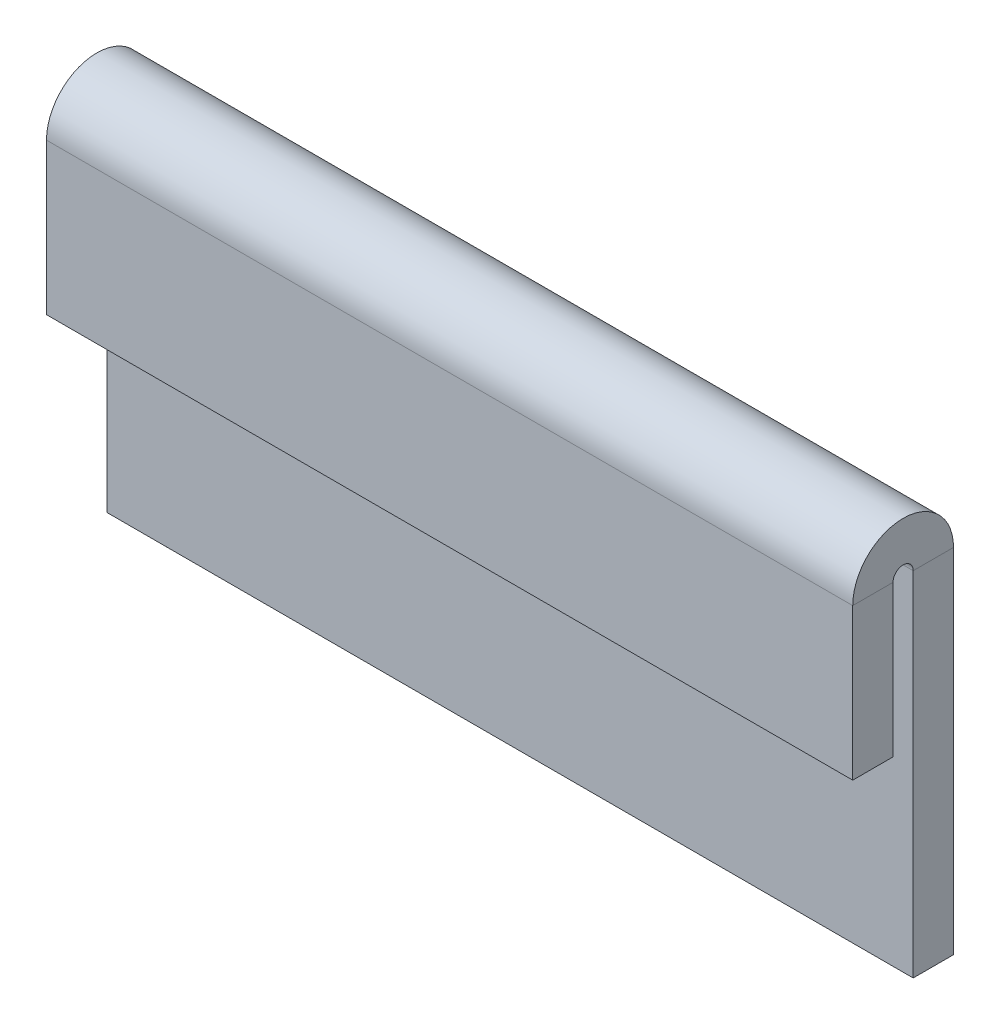
ISO-10303-21;
HEADER;
FILE_DESCRIPTION(('STEP AP214'),'2;1');
FILE_NAME('part.step','',(''),(''),'','','');
FILE_SCHEMA(('AUTOMOTIVE_DESIGN { 1 0 10303 214 1 1 1 1 }'));
ENDSEC;
DATA;
#1=APPLICATION_CONTEXT('core data for automotive mechanical design processes');
#2=APPLICATION_PROTOCOL_DEFINITION('international standard','automotive_design',2000,#1);
#3=PRODUCT_CONTEXT('',#1,'mechanical');
#4=PRODUCT('Part','Part','',(#3));
#5=PRODUCT_RELATED_PRODUCT_CATEGORY('part','',(#4));
#6=PRODUCT_DEFINITION_FORMATION('','',#4);
#7=PRODUCT_DEFINITION_CONTEXT('part definition',#1,'design');
#8=PRODUCT_DEFINITION('design','',#6,#7);
#9=PRODUCT_DEFINITION_SHAPE('','',#8);
#10=(LENGTH_UNIT() NAMED_UNIT(*) SI_UNIT(.MILLI.,.METRE.));
#11=(NAMED_UNIT(*) PLANE_ANGLE_UNIT() SI_UNIT($,.RADIAN.));
#12=(NAMED_UNIT(*) SI_UNIT($,.STERADIAN.) SOLID_ANGLE_UNIT());
#13=UNCERTAINTY_MEASURE_WITH_UNIT(LENGTH_MEASURE(1.E-05),#10,'distance_accuracy_value','');
#14=(GEOMETRIC_REPRESENTATION_CONTEXT(3) GLOBAL_UNCERTAINTY_ASSIGNED_CONTEXT((#13)) GLOBAL_UNIT_ASSIGNED_CONTEXT((#10,
#11,#12)) REPRESENTATION_CONTEXT('',''));
#15=CARTESIAN_POINT('',(0.,0.,0.));
#16=DIRECTION('',(0.,0.,1.));
#17=DIRECTION('',(1.,0.,0.));
#18=AXIS2_PLACEMENT_3D('',#15,#16,#17);
#19=CARTESIAN_POINT('',(0.,0.,-1.));
#20=DIRECTION('',(-1.,0.,0.));
#21=DIRECTION('',(0.,0.,1.));
#22=AXIS2_PLACEMENT_3D('',#19,#20,#21);
#23=PLANE('',#22);
#24=DIRECTION('',(0.,-1.,0.));
#25=VECTOR('',#24,1.);
#26=CARTESIAN_POINT('',(0.,0.,0.));
#27=LINE('',#26,#25);
#28=CARTESIAN_POINT('',(0.,8.75,0.));
#29=VERTEX_POINT('',#28);
#30=CARTESIAN_POINT('',(0.,0.,0.));
#31=VERTEX_POINT('',#30);
#32=EDGE_CURVE('E98',#29,#31,#27,.T.);
#33=ORIENTED_EDGE('',*,*,#32,.F.);
#34=DIRECTION('',(0.,0.,-1.));
#35=VECTOR('',#34,1.);
#36=CARTESIAN_POINT('',(0.,8.75,0.));
#37=LINE('',#36,#35);
#38=CARTESIAN_POINT('',(0.,8.75,-1.));
#39=VERTEX_POINT('',#38);
#40=EDGE_CURVE('E141',#29,#39,#37,.T.);
#41=ORIENTED_EDGE('',*,*,#40,.T.);
#42=DIRECTION('',(0.,-1.,0.));
#43=VECTOR('',#42,1.);
#44=CARTESIAN_POINT('',(0.,0.,-1.));
#45=LINE('',#44,#43);
#46=CARTESIAN_POINT('',(0.,0.,-1.));
#47=VERTEX_POINT('',#46);
#48=EDGE_CURVE('E94',#39,#47,#45,.T.);
#49=ORIENTED_EDGE('',*,*,#48,.T.);
#50=DIRECTION('',(0.,0.,1.));
#51=VECTOR('',#50,1.);
#52=CARTESIAN_POINT('',(0.,0.,-1.));
#53=LINE('',#52,#51);
#54=EDGE_CURVE('E48',#47,#31,#53,.T.);
#55=ORIENTED_EDGE('',*,*,#54,.T.);
#56=EDGE_LOOP('',(#33,#41,#49,#55));
#57=FACE_BOUND('',#56,.T.);
#58=ADVANCED_FACE('F44',(#57),#23,.T.);
#59=CARTESIAN_POINT('',(20.,0.,-1.));
#60=DIRECTION('',(1.,0.,0.));
#61=DIRECTION('',(0.,0.,-1.));
#62=AXIS2_PLACEMENT_3D('',#59,#60,#61);
#63=PLANE('',#62);
#64=DIRECTION('',(0.,0.,-1.));
#65=VECTOR('',#64,1.);
#66=CARTESIAN_POINT('',(20.,8.75,0.));
#67=LINE('',#66,#65);
#68=CARTESIAN_POINT('',(20.,8.75,0.));
#69=VERTEX_POINT('',#68);
#70=CARTESIAN_POINT('',(20.,8.75,-1.));
#71=VERTEX_POINT('',#70);
#72=EDGE_CURVE('E93',#69,#71,#67,.T.);
#73=ORIENTED_EDGE('',*,*,#72,.F.);
#74=DIRECTION('',(0.,1.,0.));
#75=VECTOR('',#74,1.);
#76=CARTESIAN_POINT('',(20.,0.,0.));
#77=LINE('',#76,#75);
#78=CARTESIAN_POINT('',(20.,0.,0.));
#79=VERTEX_POINT('',#78);
#80=EDGE_CURVE('E87',#79,#69,#77,.T.);
#81=ORIENTED_EDGE('',*,*,#80,.F.);
#82=DIRECTION('',(0.,0.,1.));
#83=VECTOR('',#82,1.);
#84=CARTESIAN_POINT('',(20.,0.,-1.));
#85=LINE('',#84,#83);
#86=CARTESIAN_POINT('',(20.,0.,-1.));
#87=VERTEX_POINT('',#86);
#88=EDGE_CURVE('E11',#87,#79,#85,.T.);
#89=ORIENTED_EDGE('',*,*,#88,.F.);
#90=DIRECTION('',(0.,1.,0.));
#91=VECTOR('',#90,1.);
#92=CARTESIAN_POINT('',(20.,0.,-1.));
#93=LINE('',#92,#91);
#94=EDGE_CURVE('E102',#87,#71,#93,.T.);
#95=ORIENTED_EDGE('',*,*,#94,.T.);
#96=EDGE_LOOP('',(#73,#81,#89,#95));
#97=FACE_BOUND('',#96,.T.);
#98=ADVANCED_FACE('F86',(#97),#63,.T.);
#99=CARTESIAN_POINT('',(0.,0.,-1.));
#100=DIRECTION('',(0.,-1.,0.));
#101=DIRECTION('',(0.,0.,-1.));
#102=AXIS2_PLACEMENT_3D('',#99,#100,#101);
#103=PLANE('',#102);
#104=DIRECTION('',(1.,0.,0.));
#105=VECTOR('',#104,1.);
#106=CARTESIAN_POINT('',(0.,0.,0.));
#107=LINE('',#106,#105);
#108=EDGE_CURVE('E82',#31,#79,#107,.T.);
#109=ORIENTED_EDGE('',*,*,#108,.F.);
#110=ORIENTED_EDGE('',*,*,#54,.F.);
#111=DIRECTION('',(1.,0.,0.));
#112=VECTOR('',#111,1.);
#113=CARTESIAN_POINT('',(0.,0.,-1.));
#114=LINE('',#113,#112);
#115=EDGE_CURVE('E83',#47,#87,#114,.T.);
#116=ORIENTED_EDGE('',*,*,#115,.T.);
#117=ORIENTED_EDGE('',*,*,#88,.T.);
#118=EDGE_LOOP('',(#109,#110,#116,#117));
#119=FACE_BOUND('',#118,.T.);
#120=ADVANCED_FACE('F80',(#119),#103,.T.);
#121=CARTESIAN_POINT('',(0.,0.,-1.));
#122=DIRECTION('',(0.,0.,-1.));
#123=DIRECTION('',(-1.,0.,0.));
#124=AXIS2_PLACEMENT_3D('',#121,#122,#123);
#125=PLANE('',#124);
#126=DIRECTION('',(-1.,0.,0.));
#127=VECTOR('',#126,1.);
#128=CARTESIAN_POINT('',(0.,8.75,-1.));
#129=LINE('',#128,#127);
#130=EDGE_CURVE('E160',#39,#71,#129,.F.);
#131=ORIENTED_EDGE('',*,*,#130,.T.);
#132=ORIENTED_EDGE('',*,*,#94,.F.);
#133=ORIENTED_EDGE('',*,*,#115,.F.);
#134=ORIENTED_EDGE('',*,*,#48,.F.);
#135=EDGE_LOOP('',(#131,#132,#133,#134));
#136=FACE_BOUND('',#135,.T.);
#137=ADVANCED_FACE('F164',(#136),#125,.T.);
#138=CARTESIAN_POINT('',(0.,0.,0.));
#139=DIRECTION('',(0.,0.,-1.));
#140=DIRECTION('',(-1.,0.,0.));
#141=AXIS2_PLACEMENT_3D('',#138,#139,#140);
#142=PLANE('',#141);
#143=ORIENTED_EDGE('',*,*,#80,.T.);
#144=DIRECTION('',(-1.,0.,0.));
#145=VECTOR('',#144,1.);
#146=CARTESIAN_POINT('',(0.,8.75,0.));
#147=LINE('',#146,#145);
#148=EDGE_CURVE('E149',#29,#69,#147,.F.);
#149=ORIENTED_EDGE('',*,*,#148,.F.);
#150=ORIENTED_EDGE('',*,*,#32,.T.);
#151=ORIENTED_EDGE('',*,*,#108,.T.);
#152=EDGE_LOOP('',(#143,#149,#150,#151));
#153=FACE_BOUND('',#152,.T.);
#154=ADVANCED_FACE('F96',(#153),#142,.F.);
#155=CARTESIAN_POINT('',(0.,6.875,1.5));
#156=DIRECTION('',(1.,0.,0.));
#157=DIRECTION('',(0.,1.,0.));
#158=AXIS2_PLACEMENT_3D('',#155,#156,#157);
#159=PLANE('',#158);
#160=DIRECTION('',(0.,0.,1.));
#161=VECTOR('',#160,1.);
#162=CARTESIAN_POINT('',(0.,8.75,1.5));
#163=LINE('',#162,#161);
#164=CARTESIAN_POINT('',(0.,8.75,0.5));
#165=VERTEX_POINT('',#164);
#166=CARTESIAN_POINT('',(0.,8.75,1.5));
#167=VERTEX_POINT('',#166);
#168=EDGE_CURVE('E113',#165,#167,#163,.T.);
#169=ORIENTED_EDGE('',*,*,#168,.F.);
#170=DIRECTION('',(0.,1.,0.));
#171=VECTOR('',#170,1.);
#172=CARTESIAN_POINT('',(0.,6.875,0.5));
#173=LINE('',#172,#171);
#174=CARTESIAN_POINT('',(0.,5.,0.5));
#175=VERTEX_POINT('',#174);
#176=EDGE_CURVE('E127',#175,#165,#173,.T.);
#177=ORIENTED_EDGE('',*,*,#176,.F.);
#178=DIRECTION('',(0.,0.,1.));
#179=VECTOR('',#178,1.);
#180=CARTESIAN_POINT('',(0.,5.,1.5));
#181=LINE('',#180,#179);
#182=CARTESIAN_POINT('',(0.,5.,1.5));
#183=VERTEX_POINT('',#182);
#184=EDGE_CURVE('E112',#175,#183,#181,.T.);
#185=ORIENTED_EDGE('',*,*,#184,.T.);
#186=DIRECTION('',(0.,1.,0.));
#187=VECTOR('',#186,1.);
#188=CARTESIAN_POINT('',(0.,6.875,1.5));
#189=LINE('',#188,#187);
#190=EDGE_CURVE('E139',#183,#167,#189,.T.);
#191=ORIENTED_EDGE('',*,*,#190,.T.);
#192=EDGE_LOOP('',(#169,#177,#185,#191));
#193=FACE_BOUND('',#192,.T.);
#194=ADVANCED_FACE('F191',(#193),#159,.F.);
#195=CARTESIAN_POINT('',(10.,5.,1.5));
#196=DIRECTION('',(0.,1.,0.));
#197=DIRECTION('',(-1.,0.,0.));
#198=AXIS2_PLACEMENT_3D('',#195,#196,#197);
#199=PLANE('',#198);
#200=ORIENTED_EDGE('',*,*,#184,.F.);
#201=DIRECTION('',(1.,0.,0.));
#202=VECTOR('',#201,1.);
#203=CARTESIAN_POINT('',(10.,5.,0.5));
#204=LINE('',#203,#202);
#205=CARTESIAN_POINT('',(20.,5.,0.5));
#206=VERTEX_POINT('',#205);
#207=EDGE_CURVE('E129',#206,#175,#204,.F.);
#208=ORIENTED_EDGE('',*,*,#207,.F.);
#209=DIRECTION('',(0.,0.,1.));
#210=VECTOR('',#209,1.);
#211=CARTESIAN_POINT('',(20.,5.,1.5));
#212=LINE('',#211,#210);
#213=CARTESIAN_POINT('',(20.,5.,1.5));
#214=VERTEX_POINT('',#213);
#215=EDGE_CURVE('E107',#206,#214,#212,.T.);
#216=ORIENTED_EDGE('',*,*,#215,.T.);
#217=DIRECTION('',(-1.,0.,0.));
#218=VECTOR('',#217,1.);
#219=CARTESIAN_POINT('',(10.,5.,1.5));
#220=LINE('',#219,#218);
#221=EDGE_CURVE('E115',#214,#183,#220,.T.);
#222=ORIENTED_EDGE('',*,*,#221,.T.);
#223=EDGE_LOOP('',(#200,#208,#216,#222));
#224=FACE_BOUND('',#223,.T.);
#225=ADVANCED_FACE('F197',(#224),#199,.F.);
#226=CARTESIAN_POINT('',(20.,6.875,1.5));
#227=DIRECTION('',(-1.,0.,0.));
#228=DIRECTION('',(0.,-1.,0.));
#229=AXIS2_PLACEMENT_3D('',#226,#227,#228);
#230=PLANE('',#229);
#231=DIRECTION('',(0.,1.,0.));
#232=VECTOR('',#231,1.);
#233=CARTESIAN_POINT('',(20.,6.875,0.5));
#234=LINE('',#233,#232);
#235=CARTESIAN_POINT('',(20.,8.75,0.5));
#236=VERTEX_POINT('',#235);
#237=EDGE_CURVE('E116',#236,#206,#234,.F.);
#238=ORIENTED_EDGE('',*,*,#237,.F.);
#239=DIRECTION('',(0.,0.,1.));
#240=VECTOR('',#239,1.);
#241=CARTESIAN_POINT('',(20.,8.75,1.5));
#242=LINE('',#241,#240);
#243=CARTESIAN_POINT('',(20.,8.75,1.5));
#244=VERTEX_POINT('',#243);
#245=EDGE_CURVE('E101',#236,#244,#242,.T.);
#246=ORIENTED_EDGE('',*,*,#245,.T.);
#247=DIRECTION('',(0.,-1.,0.));
#248=VECTOR('',#247,1.);
#249=CARTESIAN_POINT('',(20.,6.875,1.5));
#250=LINE('',#249,#248);
#251=EDGE_CURVE('E134',#244,#214,#250,.T.);
#252=ORIENTED_EDGE('',*,*,#251,.T.);
#253=ORIENTED_EDGE('',*,*,#215,.F.);
#254=EDGE_LOOP('',(#238,#246,#252,#253));
#255=FACE_BOUND('',#254,.T.);
#256=ADVANCED_FACE('F194',(#255),#230,.F.);
#257=CARTESIAN_POINT('',(10.,6.875,1.5));
#258=DIRECTION('',(0.,0.,1.));
#259=DIRECTION('',(1.,0.,0.));
#260=AXIS2_PLACEMENT_3D('',#257,#258,#259);
#261=PLANE('',#260);
#262=ORIENTED_EDGE('',*,*,#221,.F.);
#263=ORIENTED_EDGE('',*,*,#251,.F.);
#264=DIRECTION('',(1.,0.,0.));
#265=VECTOR('',#264,1.);
#266=CARTESIAN_POINT('',(10.,8.75,1.5));
#267=LINE('',#266,#265);
#268=EDGE_CURVE('E131',#167,#244,#267,.T.);
#269=ORIENTED_EDGE('',*,*,#268,.F.);
#270=ORIENTED_EDGE('',*,*,#190,.F.);
#271=EDGE_LOOP('',(#262,#263,#269,#270));
#272=FACE_BOUND('',#271,.T.);
#273=ADVANCED_FACE('F198',(#272),#261,.T.);
#274=CARTESIAN_POINT('',(10.,6.875,0.5));
#275=DIRECTION('',(0.,0.,1.));
#276=DIRECTION('',(1.,0.,0.));
#277=AXIS2_PLACEMENT_3D('',#274,#275,#276);
#278=PLANE('',#277);
#279=ORIENTED_EDGE('',*,*,#207,.T.);
#280=ORIENTED_EDGE('',*,*,#176,.T.);
#281=DIRECTION('',(1.,0.,0.));
#282=VECTOR('',#281,1.);
#283=CARTESIAN_POINT('',(10.,8.75,0.5));
#284=LINE('',#283,#282);
#285=EDGE_CURVE('E124',#165,#236,#284,.T.);
#286=ORIENTED_EDGE('',*,*,#285,.T.);
#287=ORIENTED_EDGE('',*,*,#237,.T.);
#288=EDGE_LOOP('',(#279,#280,#286,#287));
#289=FACE_BOUND('',#288,.T.);
#290=ADVANCED_FACE('F202',(#289),#278,.F.);
#291=CARTESIAN_POINT('',(20.,8.75,0.25));
#292=DIRECTION('',(1.,0.,0.));
#293=DIRECTION('',(0.,0.,-1.));
#294=AXIS2_PLACEMENT_3D('',#291,#292,#293);
#295=PLANE('',#294);
#296=ORIENTED_EDGE('',*,*,#245,.F.);
#297=CARTESIAN_POINT('',(20.,8.75,0.25));
#298=DIRECTION('',(-1.,0.,0.));
#299=DIRECTION('',(0.,0.,1.));
#300=AXIS2_PLACEMENT_3D('',#297,#298,#299);
#301=CIRCLE('',#300,0.25);
#302=EDGE_CURVE('E151',#69,#236,#301,.F.);
#303=ORIENTED_EDGE('',*,*,#302,.F.);
#304=ORIENTED_EDGE('',*,*,#72,.T.);
#305=CARTESIAN_POINT('',(20.,8.75,0.25));
#306=DIRECTION('',(-1.,0.,0.));
#307=DIRECTION('',(0.,0.,1.));
#308=AXIS2_PLACEMENT_3D('',#305,#306,#307);
#309=CIRCLE('',#308,1.25);
#310=EDGE_CURVE('E148',#71,#244,#309,.F.);
#311=ORIENTED_EDGE('',*,*,#310,.T.);
#312=EDGE_LOOP('',(#296,#303,#304,#311));
#313=FACE_BOUND('',#312,.T.);
#314=ADVANCED_FACE('F208',(#313),#295,.T.);
#315=CARTESIAN_POINT('',(0.,8.75,0.25));
#316=DIRECTION('',(1.,0.,0.));
#317=DIRECTION('',(0.,0.,-1.));
#318=AXIS2_PLACEMENT_3D('',#315,#316,#317);
#319=PLANE('',#318);
#320=CARTESIAN_POINT('',(0.,8.75,0.25));
#321=DIRECTION('',(-1.,0.,0.));
#322=DIRECTION('',(0.,0.,1.));
#323=AXIS2_PLACEMENT_3D('',#320,#321,#322);
#324=CIRCLE('',#323,0.25);
#325=EDGE_CURVE('E56',#165,#29,#324,.T.);
#326=ORIENTED_EDGE('',*,*,#325,.F.);
#327=ORIENTED_EDGE('',*,*,#168,.T.);
#328=CARTESIAN_POINT('',(0.,8.75,0.25));
#329=DIRECTION('',(-1.,0.,0.));
#330=DIRECTION('',(0.,0.,1.));
#331=AXIS2_PLACEMENT_3D('',#328,#329,#330);
#332=CIRCLE('',#331,1.25);
#333=EDGE_CURVE('E152',#167,#39,#332,.T.);
#334=ORIENTED_EDGE('',*,*,#333,.T.);
#335=ORIENTED_EDGE('',*,*,#40,.F.);
#336=EDGE_LOOP('',(#326,#327,#334,#335));
#337=FACE_BOUND('',#336,.T.);
#338=ADVANCED_FACE('F176',(#337),#319,.F.);
#339=CARTESIAN_POINT('',(0.,8.75,0.25));
#340=DIRECTION('',(-1.,0.,0.));
#341=DIRECTION('',(0.,0.,1.));
#342=AXIS2_PLACEMENT_3D('',#339,#340,#341);
#343=CYLINDRICAL_SURFACE('',#342,1.25);
#344=ORIENTED_EDGE('',*,*,#130,.F.);
#345=ORIENTED_EDGE('',*,*,#333,.F.);
#346=ORIENTED_EDGE('',*,*,#268,.T.);
#347=ORIENTED_EDGE('',*,*,#310,.F.);
#348=EDGE_LOOP('',(#344,#345,#346,#347));
#349=FACE_BOUND('',#348,.T.);
#350=ADVANCED_FACE('F174',(#349),#343,.T.);
#351=CARTESIAN_POINT('',(0.,8.75,0.25));
#352=DIRECTION('',(-1.,0.,0.));
#353=DIRECTION('',(0.,0.,1.));
#354=AXIS2_PLACEMENT_3D('',#351,#352,#353);
#355=CYLINDRICAL_SURFACE('',#354,0.25);
#356=ORIENTED_EDGE('',*,*,#148,.T.);
#357=ORIENTED_EDGE('',*,*,#302,.T.);
#358=ORIENTED_EDGE('',*,*,#285,.F.);
#359=ORIENTED_EDGE('',*,*,#325,.T.);
#360=EDGE_LOOP('',(#356,#357,#358,#359));
#361=FACE_BOUND('',#360,.T.);
#362=ADVANCED_FACE('F217',(#361),#355,.F.);
#363=CLOSED_SHELL('',(#58,#98,#120,#137,#154,#194,#225,#256,#273,#290,#314,#338,#350,#362));
#364=MANIFOLD_SOLID_BREP('B2',#363);
#365=ADVANCED_BREP_SHAPE_REPRESENTATION('',(#18,#364),#14);
#366=SHAPE_DEFINITION_REPRESENTATION(#9,#365);
ENDSEC;
END-ISO-10303-21;
